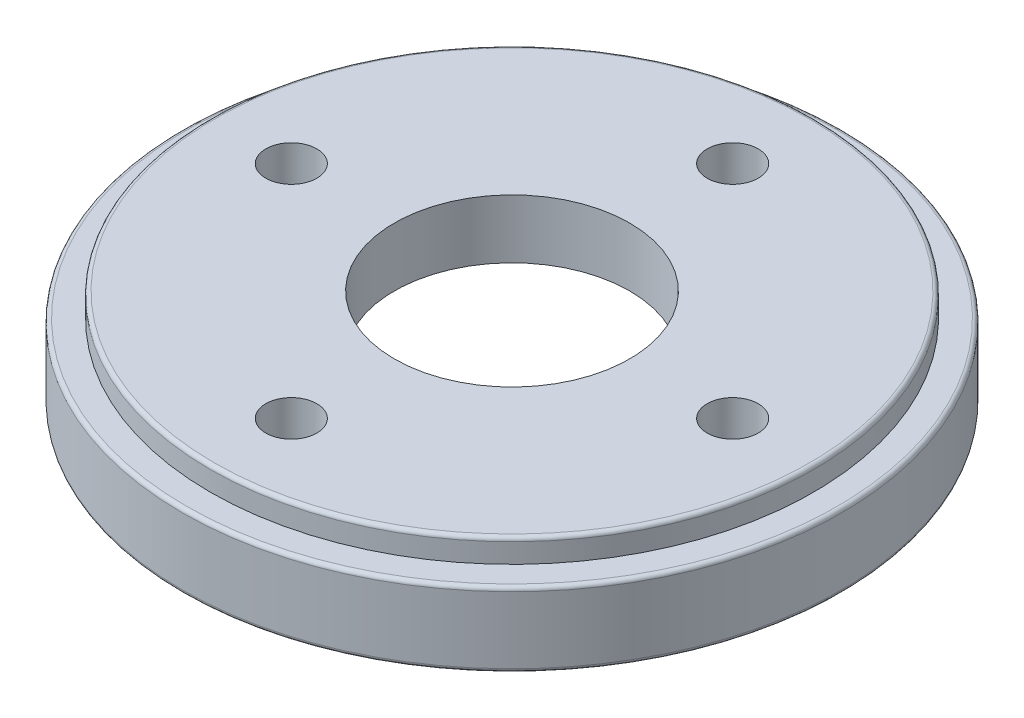
ISO-10303-21;
HEADER;
FILE_DESCRIPTION(('STEP AP214'),'2;1');
FILE_NAME('part.step','',(''),(''),'','','');
FILE_SCHEMA(('AUTOMOTIVE_DESIGN { 1 0 10303 214 1 1 1 1 }'));
ENDSEC;
DATA;
#1=APPLICATION_CONTEXT('core data for automotive mechanical design processes');
#2=APPLICATION_PROTOCOL_DEFINITION('international standard','automotive_design',2000,#1);
#3=PRODUCT_CONTEXT('',#1,'mechanical');
#4=PRODUCT('Part','Part','',(#3));
#5=PRODUCT_RELATED_PRODUCT_CATEGORY('part','',(#4));
#6=PRODUCT_DEFINITION_FORMATION('','',#4);
#7=PRODUCT_DEFINITION_CONTEXT('part definition',#1,'design');
#8=PRODUCT_DEFINITION('design','',#6,#7);
#9=PRODUCT_DEFINITION_SHAPE('','',#8);
#10=(LENGTH_UNIT() NAMED_UNIT(*) SI_UNIT(.MILLI.,.METRE.));
#11=(NAMED_UNIT(*) PLANE_ANGLE_UNIT() SI_UNIT($,.RADIAN.));
#12=(NAMED_UNIT(*) SI_UNIT($,.STERADIAN.) SOLID_ANGLE_UNIT());
#13=UNCERTAINTY_MEASURE_WITH_UNIT(LENGTH_MEASURE(1.E-05),#10,'distance_accuracy_value','');
#14=(GEOMETRIC_REPRESENTATION_CONTEXT(3) GLOBAL_UNCERTAINTY_ASSIGNED_CONTEXT((#13)) GLOBAL_UNIT_ASSIGNED_CONTEXT((#10,
#11,#12)) REPRESENTATION_CONTEXT('',''));
#15=CARTESIAN_POINT('',(0.,0.,0.));
#16=DIRECTION('',(0.,0.,1.));
#17=DIRECTION('',(1.,0.,0.));
#18=AXIS2_PLACEMENT_3D('',#15,#16,#17);
#19=CARTESIAN_POINT('',(0.,5.,-11.25));
#20=DIRECTION('',(0.,-1.,0.));
#21=DIRECTION('',(0.,0.,-1.));
#22=AXIS2_PLACEMENT_3D('',#19,#20,#21);
#23=CYLINDRICAL_SURFACE('',#22,1.3);
#24=CARTESIAN_POINT('',(0.,5.,-11.25));
#25=DIRECTION('',(0.,1.,0.));
#26=DIRECTION('',(0.,0.,1.));
#27=AXIS2_PLACEMENT_3D('',#24,#25,#26);
#28=CIRCLE('',#27,1.3);
#29=CARTESIAN_POINT('',(0.,5.,-9.95));
#30=VERTEX_POINT('',#29);
#31=EDGE_CURVE('E78',#30,#30,#28,.T.);
#32=ORIENTED_EDGE('',*,*,#31,.T.);
#33=EDGE_LOOP('',(#32));
#34=FACE_BOUND('',#33,.T.);
#35=CARTESIAN_POINT('',(0.,2.,-11.25));
#36=DIRECTION('',(0.,-1.,0.));
#37=DIRECTION('',(0.,0.,-1.));
#38=AXIS2_PLACEMENT_3D('',#35,#36,#37);
#39=CIRCLE('',#38,1.3);
#40=CARTESIAN_POINT('',(0.,2.,-12.55));
#41=VERTEX_POINT('',#40);
#42=EDGE_CURVE('E102',#41,#41,#39,.T.);
#43=ORIENTED_EDGE('',*,*,#42,.T.);
#44=EDGE_LOOP('',(#43));
#45=FACE_BOUND('',#44,.T.);
#46=ADVANCED_FACE('F40',(#34,#45),#23,.F.);
#47=CARTESIAN_POINT('',(0.,5.,0.));
#48=DIRECTION('',(0.,-1.,0.));
#49=DIRECTION('',(0.,0.,-1.));
#50=AXIS2_PLACEMENT_3D('',#47,#48,#49);
#51=CYLINDRICAL_SURFACE('',#50,6.);
#52=CARTESIAN_POINT('',(0.,5.,0.));
#53=DIRECTION('',(0.,1.,0.));
#54=DIRECTION('',(0.,0.,1.));
#55=AXIS2_PLACEMENT_3D('',#52,#53,#54);
#56=CIRCLE('',#55,6.);
#57=CARTESIAN_POINT('',(0.,5.,6.));
#58=VERTEX_POINT('',#57);
#59=EDGE_CURVE('E82',#58,#58,#56,.T.);
#60=ORIENTED_EDGE('',*,*,#59,.T.);
#61=EDGE_LOOP('',(#60));
#62=FACE_BOUND('',#61,.T.);
#63=CARTESIAN_POINT('',(0.,2.,0.));
#64=DIRECTION('',(0.,-1.,0.));
#65=DIRECTION('',(0.,0.,-1.));
#66=AXIS2_PLACEMENT_3D('',#63,#64,#65);
#67=CIRCLE('',#66,6.);
#68=CARTESIAN_POINT('',(0.,2.,-6.));
#69=VERTEX_POINT('',#68);
#70=EDGE_CURVE('E106',#69,#69,#67,.T.);
#71=ORIENTED_EDGE('',*,*,#70,.T.);
#72=EDGE_LOOP('',(#71));
#73=FACE_BOUND('',#72,.T.);
#74=ADVANCED_FACE('F150',(#62,#73),#51,.F.);
#75=CARTESIAN_POINT('',(11.2500000000003,5.,-3.17677639618484E-13));
#76=DIRECTION('',(0.,-1.,0.));
#77=DIRECTION('',(0.,0.,-1.));
#78=AXIS2_PLACEMENT_3D('',#75,#76,#77);
#79=CYLINDRICAL_SURFACE('',#78,1.30000000000025);
#80=CARTESIAN_POINT('',(11.2500000000003,5.,-3.17677639618484E-13));
#81=DIRECTION('',(0.,1.,0.));
#82=DIRECTION('',(0.,0.,1.));
#83=AXIS2_PLACEMENT_3D('',#80,#81,#82);
#84=CIRCLE('',#83,1.30000000000025);
#85=CARTESIAN_POINT('',(11.2500000000003,5.,1.29999999999993));
#86=VERTEX_POINT('',#85);
#87=EDGE_CURVE('E86',#86,#86,#84,.T.);
#88=ORIENTED_EDGE('',*,*,#87,.T.);
#89=EDGE_LOOP('',(#88));
#90=FACE_BOUND('',#89,.T.);
#91=CARTESIAN_POINT('',(11.2500000000003,2.,-3.17677639618484E-13));
#92=DIRECTION('',(0.,-1.,0.));
#93=DIRECTION('',(0.,0.,-1.));
#94=AXIS2_PLACEMENT_3D('',#91,#92,#93);
#95=CIRCLE('',#94,1.30000000000025);
#96=CARTESIAN_POINT('',(11.2500000000003,2.,-1.30000000000057));
#97=VERTEX_POINT('',#96);
#98=EDGE_CURVE('E110',#97,#97,#95,.T.);
#99=ORIENTED_EDGE('',*,*,#98,.T.);
#100=EDGE_LOOP('',(#99));
#101=FACE_BOUND('',#100,.T.);
#102=ADVANCED_FACE('F156',(#90,#101),#79,.F.);
#103=CARTESIAN_POINT('',(6.35355279236968E-13,5.,11.25));
#104=DIRECTION('',(0.,-1.,0.));
#105=DIRECTION('',(0.,0.,-1.));
#106=AXIS2_PLACEMENT_3D('',#103,#104,#105);
#107=CYLINDRICAL_SURFACE('',#106,1.30000000000068);
#108=CARTESIAN_POINT('',(6.35355279236968E-13,5.,11.25));
#109=DIRECTION('',(0.,1.,0.));
#110=DIRECTION('',(0.,0.,1.));
#111=AXIS2_PLACEMENT_3D('',#108,#109,#110);
#112=CIRCLE('',#111,1.30000000000068);
#113=CARTESIAN_POINT('',(6.35355279236968E-13,5.,12.5500000000007));
#114=VERTEX_POINT('',#113);
#115=EDGE_CURVE('E90',#114,#114,#112,.T.);
#116=ORIENTED_EDGE('',*,*,#115,.T.);
#117=EDGE_LOOP('',(#116));
#118=FACE_BOUND('',#117,.T.);
#119=CARTESIAN_POINT('',(6.35355279236968E-13,2.,11.25));
#120=DIRECTION('',(0.,-1.,0.));
#121=DIRECTION('',(0.,0.,-1.));
#122=AXIS2_PLACEMENT_3D('',#119,#120,#121);
#123=CIRCLE('',#122,1.30000000000068);
#124=CARTESIAN_POINT('',(6.35355279236968E-13,2.,9.94999999999932));
#125=VERTEX_POINT('',#124);
#126=EDGE_CURVE('E64',#125,#125,#123,.T.);
#127=ORIENTED_EDGE('',*,*,#126,.T.);
#128=EDGE_LOOP('',(#127));
#129=FACE_BOUND('',#128,.T.);
#130=ADVANCED_FACE('F167',(#118,#129),#107,.F.);
#131=CARTESIAN_POINT('',(-11.2499999999997,5.,3.19055367267525E-13));
#132=DIRECTION('',(0.,-1.,0.));
#133=DIRECTION('',(0.,0.,-1.));
#134=AXIS2_PLACEMENT_3D('',#131,#132,#133);
#135=CYLINDRICAL_SURFACE('',#134,1.30000000000051);
#136=CARTESIAN_POINT('',(-11.2499999999997,5.,3.19055367267525E-13));
#137=DIRECTION('',(0.,1.,0.));
#138=DIRECTION('',(0.,0.,1.));
#139=AXIS2_PLACEMENT_3D('',#136,#137,#138);
#140=CIRCLE('',#139,1.30000000000051);
#141=CARTESIAN_POINT('',(-11.2499999999997,5.,1.30000000000083));
#142=VERTEX_POINT('',#141);
#143=EDGE_CURVE('E94',#142,#142,#140,.T.);
#144=ORIENTED_EDGE('',*,*,#143,.T.);
#145=EDGE_LOOP('',(#144));
#146=FACE_BOUND('',#145,.T.);
#147=CARTESIAN_POINT('',(-11.2499999999997,2.,3.19055367267525E-13));
#148=DIRECTION('',(0.,-1.,0.));
#149=DIRECTION('',(0.,0.,-1.));
#150=AXIS2_PLACEMENT_3D('',#147,#148,#149);
#151=CIRCLE('',#150,1.30000000000051);
#152=CARTESIAN_POINT('',(-11.2499999999997,2.,-1.30000000000019));
#153=VERTEX_POINT('',#152);
#154=EDGE_CURVE('E61',#153,#153,#151,.T.);
#155=ORIENTED_EDGE('',*,*,#154,.T.);
#156=EDGE_LOOP('',(#155));
#157=FACE_BOUND('',#156,.T.);
#158=ADVANCED_FACE('F162',(#146,#157),#135,.F.);
#159=CARTESIAN_POINT('',(0.,5.,0.));
#160=DIRECTION('',(0.,1.,0.));
#161=DIRECTION('',(0.,0.,1.));
#162=AXIS2_PLACEMENT_3D('',#159,#160,#161);
#163=PLANE('',#162);
#164=CARTESIAN_POINT('',(0.,5.,0.));
#165=DIRECTION('',(0.,1.,0.));
#166=DIRECTION('',(0.,0.,1.));
#167=AXIS2_PLACEMENT_3D('',#164,#165,#166);
#168=CIRCLE('',#167,15.175);
#169=CARTESIAN_POINT('',(0.,5.,15.175));
#170=VERTEX_POINT('',#169);
#171=EDGE_CURVE('E58',#170,#170,#168,.T.);
#172=ORIENTED_EDGE('',*,*,#171,.T.);
#173=EDGE_LOOP('',(#172));
#174=FACE_BOUND('',#173,.T.);
#175=ORIENTED_EDGE('',*,*,#143,.F.);
#176=EDGE_LOOP('',(#175));
#177=FACE_BOUND('',#176,.T.);
#178=ORIENTED_EDGE('',*,*,#87,.F.);
#179=EDGE_LOOP('',(#178));
#180=FACE_BOUND('',#179,.T.);
#181=ORIENTED_EDGE('',*,*,#31,.F.);
#182=EDGE_LOOP('',(#181));
#183=FACE_BOUND('',#182,.T.);
#184=ORIENTED_EDGE('',*,*,#59,.F.);
#185=EDGE_LOOP('',(#184));
#186=FACE_BOUND('',#185,.T.);
#187=ORIENTED_EDGE('',*,*,#115,.F.);
#188=EDGE_LOOP('',(#187));
#189=FACE_BOUND('',#188,.T.);
#190=ADVANCED_FACE('F146',(#174,#177,#180,#183,#186,#189),#163,.T.);
#191=CARTESIAN_POINT('',(0.,5.,0.));
#192=DIRECTION('',(0.,-1.,0.));
#193=DIRECTION('',(0.,0.,-1.));
#194=AXIS2_PLACEMENT_3D('',#191,#192,#193);
#195=CYLINDRICAL_SURFACE('',#194,16.8);
#196=CARTESIAN_POINT('',(0.,0.2,0.));
#197=DIRECTION('',(0.,1.,0.));
#198=DIRECTION('',(0.,0.,1.));
#199=AXIS2_PLACEMENT_3D('',#196,#197,#198);
#200=CIRCLE('',#199,16.8);
#201=CARTESIAN_POINT('',(0.,0.2,16.8));
#202=VERTEX_POINT('',#201);
#203=EDGE_CURVE('E48',#202,#202,#200,.T.);
#204=ORIENTED_EDGE('',*,*,#203,.T.);
#205=EDGE_LOOP('',(#204));
#206=FACE_BOUND('',#205,.T.);
#207=CARTESIAN_POINT('',(0.,3.6,0.));
#208=DIRECTION('',(0.,1.,0.));
#209=DIRECTION('',(0.,0.,1.));
#210=AXIS2_PLACEMENT_3D('',#207,#208,#209);
#211=CIRCLE('',#210,16.8);
#212=CARTESIAN_POINT('',(0.,3.6,16.8));
#213=VERTEX_POINT('',#212);
#214=EDGE_CURVE('E70',#213,#213,#211,.F.);
#215=ORIENTED_EDGE('',*,*,#214,.T.);
#216=EDGE_LOOP('',(#215));
#217=FACE_BOUND('',#216,.T.);
#218=ADVANCED_FACE('F137',(#206,#217),#195,.T.);
#219=CARTESIAN_POINT('',(0.,0.,0.));
#220=DIRECTION('',(0.,1.,0.));
#221=DIRECTION('',(0.,0.,1.));
#222=AXIS2_PLACEMENT_3D('',#219,#220,#221);
#223=PLANE('',#222);
#224=CARTESIAN_POINT('',(0.,0.,0.));
#225=DIRECTION('',(0.,1.,0.));
#226=DIRECTION('',(0.,0.,1.));
#227=AXIS2_PLACEMENT_3D('',#224,#225,#226);
#228=CIRCLE('',#227,16.6);
#229=CARTESIAN_POINT('',(0.,0.,16.6));
#230=VERTEX_POINT('',#229);
#231=EDGE_CURVE('E10',#230,#230,#228,.F.);
#232=ORIENTED_EDGE('',*,*,#231,.T.);
#233=EDGE_LOOP('',(#232));
#234=FACE_BOUND('',#233,.T.);
#235=CARTESIAN_POINT('',(0.,0.,0.));
#236=DIRECTION('',(0.,-1.,0.));
#237=DIRECTION('',(0.,0.,-1.));
#238=AXIS2_PLACEMENT_3D('',#235,#236,#237);
#239=CIRCLE('',#238,14.8);
#240=CARTESIAN_POINT('',(0.,0.,-14.8));
#241=VERTEX_POINT('',#240);
#242=EDGE_CURVE('E117',#241,#241,#239,.T.);
#243=ORIENTED_EDGE('',*,*,#242,.F.);
#244=EDGE_LOOP('',(#243));
#245=FACE_BOUND('',#244,.T.);
#246=ADVANCED_FACE('F134',(#234,#245),#223,.F.);
#247=CARTESIAN_POINT('',(0.,3.8,0.));
#248=DIRECTION('',(0.,1.,0.));
#249=DIRECTION('',(0.,0.,1.));
#250=AXIS2_PLACEMENT_3D('',#247,#248,#249);
#251=PLANE('',#250);
#252=CARTESIAN_POINT('',(0.,3.8,0.));
#253=DIRECTION('',(0.,1.,0.));
#254=DIRECTION('',(0.,0.,1.));
#255=AXIS2_PLACEMENT_3D('',#252,#253,#254);
#256=CIRCLE('',#255,16.6);
#257=CARTESIAN_POINT('',(0.,3.8,16.6));
#258=VERTEX_POINT('',#257);
#259=EDGE_CURVE('E74',#258,#258,#256,.T.);
#260=ORIENTED_EDGE('',*,*,#259,.T.);
#261=EDGE_LOOP('',(#260));
#262=FACE_BOUND('',#261,.T.);
#263=CARTESIAN_POINT('',(0.,3.8,0.));
#264=DIRECTION('',(0.,1.,0.));
#265=DIRECTION('',(0.,0.,1.));
#266=AXIS2_PLACEMENT_3D('',#263,#264,#265);
#267=CIRCLE('',#266,15.375);
#268=CARTESIAN_POINT('',(0.,3.8,15.375));
#269=VERTEX_POINT('',#268);
#270=EDGE_CURVE('E98',#269,#269,#267,.T.);
#271=ORIENTED_EDGE('',*,*,#270,.F.);
#272=EDGE_LOOP('',(#271));
#273=FACE_BOUND('',#272,.T.);
#274=ADVANCED_FACE('F136',(#262,#273),#251,.T.);
#275=CARTESIAN_POINT('',(0.,3.8,0.));
#276=DIRECTION('',(0.,1.,0.));
#277=DIRECTION('',(0.,0.,1.));
#278=AXIS2_PLACEMENT_3D('',#275,#276,#277);
#279=CYLINDRICAL_SURFACE('',#278,15.375);
#280=CARTESIAN_POINT('',(0.,4.8,0.));
#281=DIRECTION('',(0.,1.,0.));
#282=DIRECTION('',(0.,0.,1.));
#283=AXIS2_PLACEMENT_3D('',#280,#281,#282);
#284=CIRCLE('',#283,15.375);
#285=CARTESIAN_POINT('',(0.,4.8,15.375));
#286=VERTEX_POINT('',#285);
#287=EDGE_CURVE('E53',#286,#286,#284,.F.);
#288=ORIENTED_EDGE('',*,*,#287,.T.);
#289=EDGE_LOOP('',(#288));
#290=FACE_BOUND('',#289,.T.);
#291=ORIENTED_EDGE('',*,*,#270,.T.);
#292=EDGE_LOOP('',(#291));
#293=FACE_BOUND('',#292,.T.);
#294=ADVANCED_FACE('F143',(#290,#293),#279,.T.);
#295=CARTESIAN_POINT('',(0.,3.6,0.));
#296=DIRECTION('',(0.,1.,0.));
#297=DIRECTION('',(0.,0.,1.));
#298=AXIS2_PLACEMENT_3D('',#295,#296,#297);
#299=TOROIDAL_SURFACE('',#298,16.6,0.2);
#300=ORIENTED_EDGE('',*,*,#214,.F.);
#301=EDGE_LOOP('',(#300));
#302=FACE_BOUND('',#301,.T.);
#303=ORIENTED_EDGE('',*,*,#259,.F.);
#304=EDGE_LOOP('',(#303));
#305=FACE_BOUND('',#304,.T.);
#306=ADVANCED_FACE('F201',(#302,#305),#299,.T.);
#307=CARTESIAN_POINT('',(0.,4.8,0.));
#308=DIRECTION('',(0.,1.,0.));
#309=DIRECTION('',(0.,0.,1.));
#310=AXIS2_PLACEMENT_3D('',#307,#308,#309);
#311=TOROIDAL_SURFACE('',#310,15.175,0.2);
#312=ORIENTED_EDGE('',*,*,#287,.F.);
#313=EDGE_LOOP('',(#312));
#314=FACE_BOUND('',#313,.T.);
#315=ORIENTED_EDGE('',*,*,#171,.F.);
#316=EDGE_LOOP('',(#315));
#317=FACE_BOUND('',#316,.T.);
#318=ADVANCED_FACE('F130',(#314,#317),#311,.T.);
#319=CARTESIAN_POINT('',(0.,2.,0.));
#320=DIRECTION('',(0.,-1.,0.));
#321=DIRECTION('',(0.,0.,-1.));
#322=AXIS2_PLACEMENT_3D('',#319,#320,#321);
#323=CYLINDRICAL_SURFACE('',#322,14.8);
#324=CARTESIAN_POINT('',(0.,2.,0.));
#325=DIRECTION('',(0.,-1.,0.));
#326=DIRECTION('',(0.,0.,-1.));
#327=AXIS2_PLACEMENT_3D('',#324,#325,#326);
#328=CIRCLE('',#327,14.8);
#329=CARTESIAN_POINT('',(0.,2.,-14.8));
#330=VERTEX_POINT('',#329);
#331=EDGE_CURVE('E65',#330,#330,#328,.T.);
#332=ORIENTED_EDGE('',*,*,#331,.F.);
#333=EDGE_LOOP('',(#332));
#334=FACE_BOUND('',#333,.T.);
#335=ORIENTED_EDGE('',*,*,#242,.T.);
#336=EDGE_LOOP('',(#335));
#337=FACE_BOUND('',#336,.T.);
#338=ADVANCED_FACE('F127',(#334,#337),#323,.F.);
#339=CARTESIAN_POINT('',(0.,2.,0.));
#340=DIRECTION('',(0.,-1.,0.));
#341=DIRECTION('',(0.,0.,-1.));
#342=AXIS2_PLACEMENT_3D('',#339,#340,#341);
#343=PLANE('',#342);
#344=ORIENTED_EDGE('',*,*,#42,.F.);
#345=EDGE_LOOP('',(#344));
#346=FACE_BOUND('',#345,.T.);
#347=ORIENTED_EDGE('',*,*,#70,.F.);
#348=EDGE_LOOP('',(#347));
#349=FACE_BOUND('',#348,.T.);
#350=ORIENTED_EDGE('',*,*,#98,.F.);
#351=EDGE_LOOP('',(#350));
#352=FACE_BOUND('',#351,.T.);
#353=ORIENTED_EDGE('',*,*,#126,.F.);
#354=EDGE_LOOP('',(#353));
#355=FACE_BOUND('',#354,.T.);
#356=ORIENTED_EDGE('',*,*,#154,.F.);
#357=EDGE_LOOP('',(#356));
#358=FACE_BOUND('',#357,.T.);
#359=ORIENTED_EDGE('',*,*,#331,.T.);
#360=EDGE_LOOP('',(#359));
#361=FACE_BOUND('',#360,.T.);
#362=ADVANCED_FACE('F125',(#346,#349,#352,#355,#358,#361),#343,.T.);
#363=CARTESIAN_POINT('',(0.,0.2,0.));
#364=DIRECTION('',(0.,1.,0.));
#365=DIRECTION('',(0.,0.,1.));
#366=AXIS2_PLACEMENT_3D('',#363,#364,#365);
#367=TOROIDAL_SURFACE('',#366,16.6,0.2);
#368=ORIENTED_EDGE('',*,*,#231,.F.);
#369=EDGE_LOOP('',(#368));
#370=FACE_BOUND('',#369,.T.);
#371=ORIENTED_EDGE('',*,*,#203,.F.);
#372=EDGE_LOOP('',(#371));
#373=FACE_BOUND('',#372,.T.);
#374=ADVANCED_FACE('F42',(#370,#373),#367,.T.);
#375=CLOSED_SHELL('',(#46,#74,#102,#130,#158,#190,#218,#246,#274,#294,#306,#318,#338,#362,#374));
#376=MANIFOLD_SOLID_BREP('B2',#375);
#377=ADVANCED_BREP_SHAPE_REPRESENTATION('',(#18,#376),#14);
#378=SHAPE_DEFINITION_REPRESENTATION(#9,#377);
ENDSEC;
END-ISO-10303-21;
